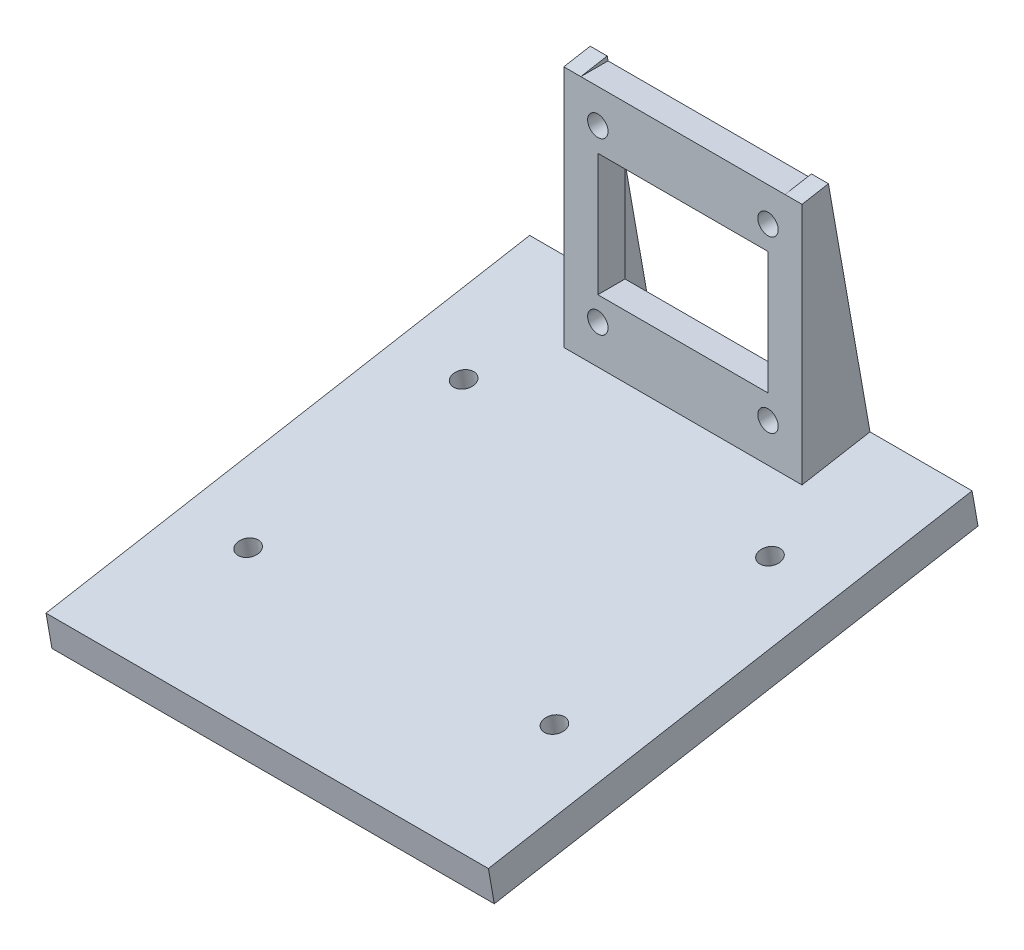
ISO-10303-21;
HEADER;
FILE_DESCRIPTION(('STEP AP214'),'2;1');
FILE_NAME('part.step','',(''),(''),'','','');
FILE_SCHEMA(('AUTOMOTIVE_DESIGN { 1 0 10303 214 1 1 1 1 }'));
ENDSEC;
DATA;
#1=APPLICATION_CONTEXT('core data for automotive mechanical design processes');
#2=APPLICATION_PROTOCOL_DEFINITION('international standard','automotive_design',2000,#1);
#3=PRODUCT_CONTEXT('',#1,'mechanical');
#4=PRODUCT('Part','Part','',(#3));
#5=PRODUCT_RELATED_PRODUCT_CATEGORY('part','',(#4));
#6=PRODUCT_DEFINITION_FORMATION('','',#4);
#7=PRODUCT_DEFINITION_CONTEXT('part definition',#1,'design');
#8=PRODUCT_DEFINITION('design','',#6,#7);
#9=PRODUCT_DEFINITION_SHAPE('','',#8);
#10=(LENGTH_UNIT() NAMED_UNIT(*) SI_UNIT(.MILLI.,.METRE.));
#11=(NAMED_UNIT(*) PLANE_ANGLE_UNIT() SI_UNIT($,.RADIAN.));
#12=(NAMED_UNIT(*) SI_UNIT($,.STERADIAN.) SOLID_ANGLE_UNIT());
#13=UNCERTAINTY_MEASURE_WITH_UNIT(LENGTH_MEASURE(1.E-05),#10,'distance_accuracy_value','');
#14=(GEOMETRIC_REPRESENTATION_CONTEXT(3) GLOBAL_UNCERTAINTY_ASSIGNED_CONTEXT((#13)) GLOBAL_UNIT_ASSIGNED_CONTEXT((#10,
#11,#12)) REPRESENTATION_CONTEXT('',''));
#15=CARTESIAN_POINT('',(0.,0.,0.));
#16=DIRECTION('',(0.,0.,1.));
#17=DIRECTION('',(1.,0.,0.));
#18=AXIS2_PLACEMENT_3D('',#15,#16,#17);
#19=CARTESIAN_POINT('',(0.,0.,4.));
#20=DIRECTION('',(0.,0.,1.));
#21=DIRECTION('',(1.,0.,0.));
#22=AXIS2_PLACEMENT_3D('',#19,#20,#21);
#23=PLANE('',#22);
#24=DIRECTION('',(1.,0.,0.));
#25=VECTOR('',#24,1.);
#26=CARTESIAN_POINT('',(5.,-26.5,4.));
#27=LINE('',#26,#25);
#28=CARTESIAN_POINT('',(5.,-26.5,4.));
#29=VERTEX_POINT('',#28);
#30=CARTESIAN_POINT('',(30.,-26.5,4.));
#31=VERTEX_POINT('',#30);
#32=EDGE_CURVE('E239',#29,#31,#27,.T.);
#33=ORIENTED_EDGE('',*,*,#32,.F.);
#34=DIRECTION('',(0.,-1.,0.));
#35=VECTOR('',#34,1.);
#36=CARTESIAN_POINT('',(5.,-26.5,4.));
#37=LINE('',#36,#35);
#38=CARTESIAN_POINT('',(5.,-8.5,4.));
#39=VERTEX_POINT('',#38);
#40=EDGE_CURVE('E237',#39,#29,#37,.T.);
#41=ORIENTED_EDGE('',*,*,#40,.F.);
#42=DIRECTION('',(-1.,0.,0.));
#43=VECTOR('',#42,1.);
#44=CARTESIAN_POINT('',(5.,-8.5,4.));
#45=LINE('',#44,#43);
#46=CARTESIAN_POINT('',(30.,-8.5,4.));
#47=VERTEX_POINT('',#46);
#48=EDGE_CURVE('E234',#47,#39,#45,.T.);
#49=ORIENTED_EDGE('',*,*,#48,.F.);
#50=DIRECTION('',(0.,1.,0.));
#51=VECTOR('',#50,1.);
#52=CARTESIAN_POINT('',(30.,-26.5,4.));
#53=LINE('',#52,#51);
#54=EDGE_CURVE('E232',#31,#47,#53,.T.);
#55=ORIENTED_EDGE('',*,*,#54,.F.);
#56=EDGE_LOOP('',(#33,#41,#49,#55));
#57=FACE_BOUND('',#56,.T.);
#58=DIRECTION('',(1.,0.,0.));
#59=VECTOR('',#58,1.);
#60=CARTESIAN_POINT('',(-12.493645916048,0.,4.));
#61=LINE('',#60,#59);
#62=CARTESIAN_POINT('',(0.,0.,4.));
#63=VERTEX_POINT('',#62);
#64=CARTESIAN_POINT('',(2.5,0.,4.));
#65=VERTEX_POINT('',#64);
#66=EDGE_CURVE('E192',#63,#65,#61,.T.);
#67=ORIENTED_EDGE('',*,*,#66,.F.);
#68=DIRECTION('',(0.,-1.,0.));
#69=VECTOR('',#68,1.);
#70=CARTESIAN_POINT('',(0.,0.,4.));
#71=LINE('',#70,#69);
#72=CARTESIAN_POINT('',(0.,-35.7053079228339,4.));
#73=VERTEX_POINT('',#72);
#74=EDGE_CURVE('E287',#63,#73,#71,.T.);
#75=ORIENTED_EDGE('',*,*,#74,.T.);
#76=DIRECTION('',(-1.,0.,0.));
#77=VECTOR('',#76,1.);
#78=CARTESIAN_POINT('',(39.061706447543,-35.7053079228339,4.));
#79=LINE('',#78,#77);
#80=CARTESIAN_POINT('',(35.,-35.7053079228339,4.));
#81=VERTEX_POINT('',#80);
#82=EDGE_CURVE('E183',#81,#73,#79,.T.);
#83=ORIENTED_EDGE('',*,*,#82,.F.);
#84=DIRECTION('',(0.,1.,0.));
#85=VECTOR('',#84,1.);
#86=CARTESIAN_POINT('',(35.,0.,4.));
#87=LINE('',#86,#85);
#88=CARTESIAN_POINT('',(35.,0.,4.));
#89=VERTEX_POINT('',#88);
#90=EDGE_CURVE('E289',#81,#89,#87,.T.);
#91=ORIENTED_EDGE('',*,*,#90,.T.);
#92=CARTESIAN_POINT('',(32.5,0.,4.));
#93=VERTEX_POINT('',#92);
#94=EDGE_CURVE('E186',#93,#89,#61,.T.);
#95=ORIENTED_EDGE('',*,*,#94,.F.);
#96=DIRECTION('',(-1.,0.,0.));
#97=VECTOR('',#96,1.);
#98=CARTESIAN_POINT('',(0.,0.,4.));
#99=LINE('',#98,#97);
#100=EDGE_CURVE('E292',#93,#65,#99,.T.);
#101=ORIENTED_EDGE('',*,*,#100,.T.);
#102=EDGE_LOOP('',(#67,#75,#83,#91,#95,#101));
#103=FACE_BOUND('',#102,.T.);
#104=CARTESIAN_POINT('',(30.,-30.,4.));
#105=DIRECTION('',(0.,0.,1.));
#106=DIRECTION('',(-1.,0.,0.));
#107=AXIS2_PLACEMENT_3D('',#104,#105,#106);
#108=CIRCLE('',#107,1.50000000000001);
#109=CARTESIAN_POINT('',(28.5,-30.,4.));
#110=VERTEX_POINT('',#109);
#111=EDGE_CURVE('E275',#110,#110,#108,.T.);
#112=ORIENTED_EDGE('',*,*,#111,.F.);
#113=EDGE_LOOP('',(#112));
#114=FACE_BOUND('',#113,.T.);
#115=CARTESIAN_POINT('',(5.00000000000001,-30.,4.));
#116=DIRECTION('',(0.,0.,1.));
#117=DIRECTION('',(-1.,0.,0.));
#118=AXIS2_PLACEMENT_3D('',#115,#116,#117);
#119=CIRCLE('',#118,1.5);
#120=CARTESIAN_POINT('',(3.50000000000001,-30.,4.));
#121=VERTEX_POINT('',#120);
#122=EDGE_CURVE('E263',#121,#121,#119,.T.);
#123=ORIENTED_EDGE('',*,*,#122,.F.);
#124=EDGE_LOOP('',(#123));
#125=FACE_BOUND('',#124,.T.);
#126=CARTESIAN_POINT('',(5.00000000000001,-5.,4.));
#127=DIRECTION('',(0.,0.,1.));
#128=DIRECTION('',(1.,0.,0.));
#129=AXIS2_PLACEMENT_3D('',#126,#127,#128);
#130=CIRCLE('',#129,1.5);
#131=CARTESIAN_POINT('',(6.50000000000001,-5.,4.));
#132=VERTEX_POINT('',#131);
#133=EDGE_CURVE('E281',#132,#132,#130,.T.);
#134=ORIENTED_EDGE('',*,*,#133,.F.);
#135=EDGE_LOOP('',(#134));
#136=FACE_BOUND('',#135,.T.);
#137=CARTESIAN_POINT('',(30.,-5.,4.));
#138=DIRECTION('',(0.,0.,1.));
#139=DIRECTION('',(1.,0.,0.));
#140=AXIS2_PLACEMENT_3D('',#137,#138,#139);
#141=CIRCLE('',#140,1.50000000000001);
#142=CARTESIAN_POINT('',(31.5,-5.,4.));
#143=VERTEX_POINT('',#142);
#144=EDGE_CURVE('E269',#143,#143,#141,.T.);
#145=ORIENTED_EDGE('',*,*,#144,.F.);
#146=EDGE_LOOP('',(#145));
#147=FACE_BOUND('',#146,.T.);
#148=ADVANCED_FACE('F37',(#57,#103,#114,#125,#136,#147),#23,.T.);
#149=CARTESIAN_POINT('',(0.,0.,0.));
#150=DIRECTION('',(0.,0.,1.));
#151=DIRECTION('',(1.,0.,0.));
#152=AXIS2_PLACEMENT_3D('',#149,#150,#151);
#153=PLANE('',#152);
#154=CARTESIAN_POINT('',(5.00000000000001,-30.,0.));
#155=DIRECTION('',(0.,0.,1.));
#156=DIRECTION('',(-1.,0.,0.));
#157=AXIS2_PLACEMENT_3D('',#154,#155,#156);
#158=CIRCLE('',#157,1.5);
#159=CARTESIAN_POINT('',(3.50000000000001,-30.,0.));
#160=VERTEX_POINT('',#159);
#161=EDGE_CURVE('E262',#160,#160,#158,.T.);
#162=ORIENTED_EDGE('',*,*,#161,.T.);
#163=EDGE_LOOP('',(#162));
#164=FACE_BOUND('',#163,.T.);
#165=CARTESIAN_POINT('',(30.,-5.,0.));
#166=DIRECTION('',(0.,0.,1.));
#167=DIRECTION('',(1.,0.,0.));
#168=AXIS2_PLACEMENT_3D('',#165,#166,#167);
#169=CIRCLE('',#168,1.50000000000001);
#170=CARTESIAN_POINT('',(31.5,-5.,0.));
#171=VERTEX_POINT('',#170);
#172=EDGE_CURVE('E266',#171,#171,#169,.T.);
#173=ORIENTED_EDGE('',*,*,#172,.T.);
#174=EDGE_LOOP('',(#173));
#175=FACE_BOUND('',#174,.T.);
#176=CARTESIAN_POINT('',(30.,-30.,0.));
#177=DIRECTION('',(0.,0.,1.));
#178=DIRECTION('',(-1.,0.,0.));
#179=AXIS2_PLACEMENT_3D('',#176,#177,#178);
#180=CIRCLE('',#179,1.50000000000001);
#181=CARTESIAN_POINT('',(28.5,-30.,0.));
#182=VERTEX_POINT('',#181);
#183=EDGE_CURVE('E272',#182,#182,#180,.T.);
#184=ORIENTED_EDGE('',*,*,#183,.T.);
#185=EDGE_LOOP('',(#184));
#186=FACE_BOUND('',#185,.T.);
#187=CARTESIAN_POINT('',(5.00000000000001,-5.,0.));
#188=DIRECTION('',(0.,0.,1.));
#189=DIRECTION('',(1.,0.,0.));
#190=AXIS2_PLACEMENT_3D('',#187,#188,#189);
#191=CIRCLE('',#190,1.5);
#192=CARTESIAN_POINT('',(6.50000000000001,-5.,0.));
#193=VERTEX_POINT('',#192);
#194=EDGE_CURVE('E278',#193,#193,#191,.T.);
#195=ORIENTED_EDGE('',*,*,#194,.T.);
#196=EDGE_LOOP('',(#195));
#197=FACE_BOUND('',#196,.T.);
#198=DIRECTION('',(-1.,0.,0.));
#199=VECTOR('',#198,1.);
#200=CARTESIAN_POINT('',(0.,0.,0.));
#201=LINE('',#200,#199);
#202=CARTESIAN_POINT('',(32.5,0.,0.));
#203=VERTEX_POINT('',#202);
#204=CARTESIAN_POINT('',(2.5,0.,0.));
#205=VERTEX_POINT('',#204);
#206=EDGE_CURVE('E290',#203,#205,#201,.T.);
#207=ORIENTED_EDGE('',*,*,#206,.F.);
#208=DIRECTION('',(0.,-1.,0.));
#209=VECTOR('',#208,1.);
#210=CARTESIAN_POINT('',(32.5,0.,0.));
#211=LINE('',#210,#209);
#212=CARTESIAN_POINT('',(32.5,-35.,0.));
#213=VERTEX_POINT('',#212);
#214=EDGE_CURVE('E54',#203,#213,#211,.T.);
#215=ORIENTED_EDGE('',*,*,#214,.T.);
#216=DIRECTION('',(1.,0.,0.));
#217=VECTOR('',#216,1.);
#218=CARTESIAN_POINT('',(0.,-35.,0.));
#219=LINE('',#218,#217);
#220=CARTESIAN_POINT('',(2.5,-35.,0.));
#221=VERTEX_POINT('',#220);
#222=EDGE_CURVE('E284',#221,#213,#219,.T.);
#223=ORIENTED_EDGE('',*,*,#222,.F.);
#224=DIRECTION('',(0.,1.,0.));
#225=VECTOR('',#224,1.);
#226=CARTESIAN_POINT('',(2.5,0.,0.));
#227=LINE('',#226,#225);
#228=EDGE_CURVE('E229',#221,#205,#227,.T.);
#229=ORIENTED_EDGE('',*,*,#228,.T.);
#230=EDGE_LOOP('',(#207,#215,#223,#229));
#231=FACE_BOUND('',#230,.T.);
#232=DIRECTION('',(0.,1.,0.));
#233=VECTOR('',#232,1.);
#234=CARTESIAN_POINT('',(30.,-26.5,0.));
#235=LINE('',#234,#233);
#236=CARTESIAN_POINT('',(30.,-26.5,0.));
#237=VERTEX_POINT('',#236);
#238=CARTESIAN_POINT('',(30.,-8.5,0.));
#239=VERTEX_POINT('',#238);
#240=EDGE_CURVE('E242',#237,#239,#235,.T.);
#241=ORIENTED_EDGE('',*,*,#240,.T.);
#242=DIRECTION('',(-1.,0.,0.));
#243=VECTOR('',#242,1.);
#244=CARTESIAN_POINT('',(5.,-8.5,0.));
#245=LINE('',#244,#243);
#246=CARTESIAN_POINT('',(5.,-8.5,0.));
#247=VERTEX_POINT('',#246);
#248=EDGE_CURVE('E245',#239,#247,#245,.T.);
#249=ORIENTED_EDGE('',*,*,#248,.T.);
#250=DIRECTION('',(0.,-1.,0.));
#251=VECTOR('',#250,1.);
#252=CARTESIAN_POINT('',(5.,-26.5,0.));
#253=LINE('',#252,#251);
#254=CARTESIAN_POINT('',(5.,-26.5,0.));
#255=VERTEX_POINT('',#254);
#256=EDGE_CURVE('E248',#247,#255,#253,.T.);
#257=ORIENTED_EDGE('',*,*,#256,.T.);
#258=DIRECTION('',(1.,0.,0.));
#259=VECTOR('',#258,1.);
#260=CARTESIAN_POINT('',(5.,-26.5,0.));
#261=LINE('',#260,#259);
#262=EDGE_CURVE('E235',#255,#237,#261,.T.);
#263=ORIENTED_EDGE('',*,*,#262,.T.);
#264=EDGE_LOOP('',(#241,#249,#257,#263));
#265=FACE_BOUND('',#264,.T.);
#266=ADVANCED_FACE('F321',(#164,#175,#186,#197,#231,#265),#153,.F.);
#267=CARTESIAN_POINT('',(0.,0.,4.));
#268=DIRECTION('',(1.,0.,0.));
#269=DIRECTION('',(0.,0.,-1.));
#270=AXIS2_PLACEMENT_3D('',#267,#268,#269);
#271=PLANE('',#270);
#272=ORIENTED_EDGE('',*,*,#74,.F.);
#273=DIRECTION('',(0.,0.173648177666934,-0.984807753012207));
#274=VECTOR('',#273,1.);
#275=CARTESIAN_POINT('',(0.,0.684040286651359,0.120614758428189));
#276=LINE('',#275,#274);
#277=CARTESIAN_POINT('',(0.,0.684040286651359,0.120614758428189));
#278=VERTEX_POINT('',#277);
#279=EDGE_CURVE('E213',#63,#278,#276,.T.);
#280=ORIENTED_EDGE('',*,*,#279,.T.);
#281=DIRECTION('',(0.,-0.984807753012207,-0.173648177666934));
#282=VECTOR('',#281,1.);
#283=CARTESIAN_POINT('',(0.,0.684040286651359,0.120614758428189));
#284=LINE('',#283,#282);
#285=CARTESIAN_POINT('',(0.,-33.9446208637534,-5.98535250819933));
#286=VERTEX_POINT('',#285);
#287=EDGE_CURVE('E222',#278,#286,#284,.T.);
#288=ORIENTED_EDGE('',*,*,#287,.T.);
#289=DIRECTION('',(0.,0.173648177666934,-0.984807753012207));
#290=VECTOR('',#289,1.);
#291=CARTESIAN_POINT('',(0.,-33.9446208637534,-5.98535250819933));
#292=LINE('',#291,#290);
#293=EDGE_CURVE('E223',#73,#286,#292,.T.);
#294=ORIENTED_EDGE('',*,*,#293,.F.);
#295=EDGE_LOOP('',(#272,#280,#288,#294));
#296=FACE_BOUND('',#295,.T.);
#297=ADVANCED_FACE('F39',(#296),#271,.F.);
#298=CARTESIAN_POINT('',(35.,0.,4.));
#299=DIRECTION('',(-1.,0.,0.));
#300=DIRECTION('',(0.,-1.,0.));
#301=AXIS2_PLACEMENT_3D('',#298,#299,#300);
#302=PLANE('',#301);
#303=DIRECTION('',(0.,-0.173648177666934,0.984807753012207));
#304=VECTOR('',#303,1.);
#305=CARTESIAN_POINT('',(35.,0.684040286651359,0.120614758428189));
#306=LINE('',#305,#304);
#307=CARTESIAN_POINT('',(35.,0.684040286651359,0.120614758428189));
#308=VERTEX_POINT('',#307);
#309=EDGE_CURVE('E198',#308,#89,#306,.T.);
#310=ORIENTED_EDGE('',*,*,#309,.T.);
#311=ORIENTED_EDGE('',*,*,#90,.F.);
#312=DIRECTION('',(0.,-0.173648177666934,0.984807753012207));
#313=VECTOR('',#312,1.);
#314=CARTESIAN_POINT('',(35.,-33.9446208637534,-5.98535250819933));
#315=LINE('',#314,#313);
#316=CARTESIAN_POINT('',(35.,-33.9446208637534,-5.98535250819932));
#317=VERTEX_POINT('',#316);
#318=EDGE_CURVE('E202',#317,#81,#315,.T.);
#319=ORIENTED_EDGE('',*,*,#318,.F.);
#320=DIRECTION('',(0.,-0.984807753012207,-0.173648177666934));
#321=VECTOR('',#320,1.);
#322=CARTESIAN_POINT('',(35.,0.684040286651359,0.120614758428189));
#323=LINE('',#322,#321);
#324=EDGE_CURVE('E194',#308,#317,#323,.T.);
#325=ORIENTED_EDGE('',*,*,#324,.F.);
#326=EDGE_LOOP('',(#310,#311,#319,#325));
#327=FACE_BOUND('',#326,.T.);
#328=ADVANCED_FACE('F364',(#327),#302,.F.);
#329=CARTESIAN_POINT('',(0.,0.,4.));
#330=DIRECTION('',(0.,-1.,0.));
#331=DIRECTION('',(0.,0.,-1.));
#332=AXIS2_PLACEMENT_3D('',#329,#330,#331);
#333=PLANE('',#332);
#334=ORIENTED_EDGE('',*,*,#100,.F.);
#335=DIRECTION('',(0.,0.,-1.));
#336=VECTOR('',#335,1.);
#337=CARTESIAN_POINT('',(32.5,0.,4.));
#338=LINE('',#337,#336);
#339=EDGE_CURVE('E11',#93,#203,#338,.T.);
#340=ORIENTED_EDGE('',*,*,#339,.T.);
#341=ORIENTED_EDGE('',*,*,#206,.T.);
#342=DIRECTION('',(0.,0.,1.));
#343=VECTOR('',#342,1.);
#344=CARTESIAN_POINT('',(2.5,0.,4.));
#345=LINE('',#344,#343);
#346=EDGE_CURVE('E46',#205,#65,#345,.T.);
#347=ORIENTED_EDGE('',*,*,#346,.T.);
#348=EDGE_LOOP('',(#334,#340,#341,#347));
#349=FACE_BOUND('',#348,.T.);
#350=ADVANCED_FACE('F362',(#349),#333,.F.);
#351=CARTESIAN_POINT('',(5.00000000000001,-5.,4.));
#352=DIRECTION('',(0.,0.,-1.));
#353=DIRECTION('',(-1.,0.,0.));
#354=AXIS2_PLACEMENT_3D('',#351,#352,#353);
#355=CYLINDRICAL_SURFACE('',#354,1.5);
#356=ORIENTED_EDGE('',*,*,#133,.T.);
#357=EDGE_LOOP('',(#356));
#358=FACE_BOUND('',#357,.T.);
#359=ORIENTED_EDGE('',*,*,#194,.F.);
#360=EDGE_LOOP('',(#359));
#361=FACE_BOUND('',#360,.T.);
#362=ADVANCED_FACE('F359',(#358,#361),#355,.F.);
#363=CARTESIAN_POINT('',(30.,-30.,4.));
#364=DIRECTION('',(0.,0.,-1.));
#365=DIRECTION('',(-1.,0.,0.));
#366=AXIS2_PLACEMENT_3D('',#363,#364,#365);
#367=CYLINDRICAL_SURFACE('',#366,1.50000000000001);
#368=ORIENTED_EDGE('',*,*,#111,.T.);
#369=EDGE_LOOP('',(#368));
#370=FACE_BOUND('',#369,.T.);
#371=ORIENTED_EDGE('',*,*,#183,.F.);
#372=EDGE_LOOP('',(#371));
#373=FACE_BOUND('',#372,.T.);
#374=ADVANCED_FACE('F692',(#370,#373),#367,.F.);
#375=CARTESIAN_POINT('',(30.,-5.,4.));
#376=DIRECTION('',(0.,0.,-1.));
#377=DIRECTION('',(-1.,0.,0.));
#378=AXIS2_PLACEMENT_3D('',#375,#376,#377);
#379=CYLINDRICAL_SURFACE('',#378,1.50000000000001);
#380=ORIENTED_EDGE('',*,*,#144,.T.);
#381=EDGE_LOOP('',(#380));
#382=FACE_BOUND('',#381,.T.);
#383=ORIENTED_EDGE('',*,*,#172,.F.);
#384=EDGE_LOOP('',(#383));
#385=FACE_BOUND('',#384,.T.);
#386=ADVANCED_FACE('F681',(#382,#385),#379,.F.);
#387=CARTESIAN_POINT('',(5.00000000000001,-30.,4.));
#388=DIRECTION('',(0.,0.,-1.));
#389=DIRECTION('',(-1.,0.,0.));
#390=AXIS2_PLACEMENT_3D('',#387,#388,#389);
#391=CYLINDRICAL_SURFACE('',#390,1.5);
#392=ORIENTED_EDGE('',*,*,#122,.T.);
#393=EDGE_LOOP('',(#392));
#394=FACE_BOUND('',#393,.T.);
#395=ORIENTED_EDGE('',*,*,#161,.F.);
#396=EDGE_LOOP('',(#395));
#397=FACE_BOUND('',#396,.T.);
#398=ADVANCED_FACE('F649',(#394,#397),#391,.F.);
#399=CARTESIAN_POINT('',(30.,-26.5,4.));
#400=DIRECTION('',(-1.,0.,0.));
#401=DIRECTION('',(0.,0.,1.));
#402=AXIS2_PLACEMENT_3D('',#399,#400,#401);
#403=PLANE('',#402);
#404=ORIENTED_EDGE('',*,*,#240,.F.);
#405=DIRECTION('',(0.,0.,-1.));
#406=VECTOR('',#405,1.);
#407=CARTESIAN_POINT('',(30.,-26.5,4.));
#408=LINE('',#407,#406);
#409=EDGE_CURVE('E241',#31,#237,#408,.T.);
#410=ORIENTED_EDGE('',*,*,#409,.F.);
#411=ORIENTED_EDGE('',*,*,#54,.T.);
#412=DIRECTION('',(0.,0.,-1.));
#413=VECTOR('',#412,1.);
#414=CARTESIAN_POINT('',(30.,-8.5,4.));
#415=LINE('',#414,#413);
#416=EDGE_CURVE('E259',#47,#239,#415,.T.);
#417=ORIENTED_EDGE('',*,*,#416,.T.);
#418=EDGE_LOOP('',(#404,#410,#411,#417));
#419=FACE_BOUND('',#418,.T.);
#420=ADVANCED_FACE('F329',(#419),#403,.T.);
#421=CARTESIAN_POINT('',(5.,-8.5,4.));
#422=DIRECTION('',(0.,-1.,0.));
#423=DIRECTION('',(0.,0.,-1.));
#424=AXIS2_PLACEMENT_3D('',#421,#422,#423);
#425=PLANE('',#424);
#426=ORIENTED_EDGE('',*,*,#248,.F.);
#427=ORIENTED_EDGE('',*,*,#416,.F.);
#428=ORIENTED_EDGE('',*,*,#48,.T.);
#429=DIRECTION('',(0.,0.,-1.));
#430=VECTOR('',#429,1.);
#431=CARTESIAN_POINT('',(5.,-8.5,4.));
#432=LINE('',#431,#430);
#433=EDGE_CURVE('E257',#39,#247,#432,.T.);
#434=ORIENTED_EDGE('',*,*,#433,.T.);
#435=EDGE_LOOP('',(#426,#427,#428,#434));
#436=FACE_BOUND('',#435,.T.);
#437=ADVANCED_FACE('F341',(#436),#425,.T.);
#438=CARTESIAN_POINT('',(5.,-26.5,4.));
#439=DIRECTION('',(1.,0.,0.));
#440=DIRECTION('',(0.,0.,-1.));
#441=AXIS2_PLACEMENT_3D('',#438,#439,#440);
#442=PLANE('',#441);
#443=ORIENTED_EDGE('',*,*,#256,.F.);
#444=ORIENTED_EDGE('',*,*,#433,.F.);
#445=ORIENTED_EDGE('',*,*,#40,.T.);
#446=DIRECTION('',(0.,0.,-1.));
#447=VECTOR('',#446,1.);
#448=CARTESIAN_POINT('',(5.,-26.5,4.));
#449=LINE('',#448,#447);
#450=EDGE_CURVE('E255',#29,#255,#449,.T.);
#451=ORIENTED_EDGE('',*,*,#450,.T.);
#452=EDGE_LOOP('',(#443,#444,#445,#451));
#453=FACE_BOUND('',#452,.T.);
#454=ADVANCED_FACE('F345',(#453),#442,.T.);
#455=CARTESIAN_POINT('',(5.,-26.5,4.));
#456=DIRECTION('',(0.,1.,0.));
#457=DIRECTION('',(0.,0.,1.));
#458=AXIS2_PLACEMENT_3D('',#455,#456,#457);
#459=PLANE('',#458);
#460=ORIENTED_EDGE('',*,*,#262,.F.);
#461=ORIENTED_EDGE('',*,*,#450,.F.);
#462=ORIENTED_EDGE('',*,*,#32,.T.);
#463=ORIENTED_EDGE('',*,*,#409,.T.);
#464=EDGE_LOOP('',(#460,#461,#462,#463));
#465=FACE_BOUND('',#464,.T.);
#466=ADVANCED_FACE('F333',(#465),#459,.T.);
#467=CARTESIAN_POINT('',(2.5,0.684040286651359,0.12061475842819));
#468=DIRECTION('',(1.,0.,0.));
#469=DIRECTION('',(0.,0.,-1.));
#470=AXIS2_PLACEMENT_3D('',#467,#468,#469);
#471=PLANE('',#470);
#472=ORIENTED_EDGE('',*,*,#228,.F.);
#473=DIRECTION('',(0.,-0.173648177666934,0.984807753012207));
#474=VECTOR('',#473,1.);
#475=CARTESIAN_POINT('',(2.5,-33.9446208637534,-5.98535250819932));
#476=LINE('',#475,#474);
#477=CARTESIAN_POINT('',(2.5,-33.9446208637534,-5.98535250819932));
#478=VERTEX_POINT('',#477);
#479=EDGE_CURVE('E216',#478,#221,#476,.T.);
#480=ORIENTED_EDGE('',*,*,#479,.F.);
#481=DIRECTION('',(0.,-0.984807753012207,-0.173648177666934));
#482=VECTOR('',#481,1.);
#483=CARTESIAN_POINT('',(2.5,0.684040286651359,0.12061475842819));
#484=LINE('',#483,#482);
#485=EDGE_CURVE('E230',#205,#478,#484,.T.);
#486=ORIENTED_EDGE('',*,*,#485,.F.);
#487=EDGE_LOOP('',(#472,#480,#486));
#488=FACE_BOUND('',#487,.T.);
#489=ADVANCED_FACE('F320',(#488),#471,.T.);
#490=ORIENTED_EDGE('',*,*,#346,.F.);
#491=CARTESIAN_POINT('',(2.5,0.684040286651359,0.12061475842819));
#492=VERTEX_POINT('',#491);
#493=EDGE_CURVE('E226',#492,#205,#484,.T.);
#494=ORIENTED_EDGE('',*,*,#493,.F.);
#495=DIRECTION('',(0.,-0.173648177666934,0.984807753012207));
#496=VECTOR('',#495,1.);
#497=CARTESIAN_POINT('',(2.5,0.684040286651359,0.12061475842819));
#498=LINE('',#497,#496);
#499=EDGE_CURVE('E219',#492,#65,#498,.T.);
#500=ORIENTED_EDGE('',*,*,#499,.T.);
#501=EDGE_LOOP('',(#490,#494,#500));
#502=FACE_BOUND('',#501,.T.);
#503=ADVANCED_FACE('F404',(#502),#471,.T.);
#504=CARTESIAN_POINT('',(0.,0.684040286651359,0.120614758428189));
#505=DIRECTION('',(0.,0.173648177666934,-0.984807753012207));
#506=DIRECTION('',(0.,0.984807753012207,0.173648177666934));
#507=AXIS2_PLACEMENT_3D('',#504,#505,#506);
#508=PLANE('',#507);
#509=ORIENTED_EDGE('',*,*,#493,.T.);
#510=ORIENTED_EDGE('',*,*,#485,.T.);
#511=DIRECTION('',(1.,0.,0.));
#512=VECTOR('',#511,1.);
#513=CARTESIAN_POINT('',(-15.,-33.9446208637534,-5.98535250819932));
#514=LINE('',#513,#512);
#515=CARTESIAN_POINT('',(32.5,-33.9446208637534,-5.98535250819932));
#516=VERTEX_POINT('',#515);
#517=EDGE_CURVE('E317',#478,#516,#514,.T.);
#518=ORIENTED_EDGE('',*,*,#517,.T.);
#519=DIRECTION('',(0.,-0.984807753012207,-0.173648177666934));
#520=VECTOR('',#519,1.);
#521=CARTESIAN_POINT('',(32.5,0.684040286651359,0.12061475842819));
#522=LINE('',#521,#520);
#523=EDGE_CURVE('E199',#203,#516,#522,.T.);
#524=ORIENTED_EDGE('',*,*,#523,.F.);
#525=CARTESIAN_POINT('',(32.5,0.684040286651359,0.12061475842819));
#526=VERTEX_POINT('',#525);
#527=EDGE_CURVE('E195',#526,#203,#522,.T.);
#528=ORIENTED_EDGE('',*,*,#527,.F.);
#529=DIRECTION('',(1.,0.,0.));
#530=VECTOR('',#529,1.);
#531=CARTESIAN_POINT('',(35.,0.684040286651359,0.120614758428189));
#532=LINE('',#531,#530);
#533=EDGE_CURVE('E209',#526,#308,#532,.T.);
#534=ORIENTED_EDGE('',*,*,#533,.T.);
#535=ORIENTED_EDGE('',*,*,#324,.T.);
#536=CARTESIAN_POINT('',(50.,-33.9446208637534,-5.98535250819932));
#537=VERTEX_POINT('',#536);
#538=EDGE_CURVE('E421',#317,#537,#514,.T.);
#539=ORIENTED_EDGE('',*,*,#538,.T.);
#540=DIRECTION('',(0.,0.984807753012208,0.173648177666934));
#541=VECTOR('',#540,1.);
#542=CARTESIAN_POINT('',(50.,-38.8686596288144,-6.85359339653399));
#543=LINE('',#542,#541);
#544=CARTESIAN_POINT('',(50.,-38.8686596288144,-6.85359339653399));
#545=VERTEX_POINT('',#544);
#546=EDGE_CURVE('E188',#545,#537,#543,.T.);
#547=ORIENTED_EDGE('',*,*,#546,.F.);
#548=DIRECTION('',(1.,0.,0.));
#549=VECTOR('',#548,1.);
#550=CARTESIAN_POINT('',(-15.,-38.8686596288144,-6.85359339653399));
#551=LINE('',#550,#549);
#552=CARTESIAN_POINT('',(-15.,-38.8686596288144,-6.85359339653399));
#553=VERTEX_POINT('',#552);
#554=EDGE_CURVE('E168',#553,#545,#551,.T.);
#555=ORIENTED_EDGE('',*,*,#554,.F.);
#556=DIRECTION('',(0.,0.984807753012208,0.173648177666934));
#557=VECTOR('',#556,1.);
#558=CARTESIAN_POINT('',(-15.,-38.8686596288144,-6.85359339653399));
#559=LINE('',#558,#557);
#560=CARTESIAN_POINT('',(-15.,-33.9446208637534,-5.98535250819932));
#561=VERTEX_POINT('',#560);
#562=EDGE_CURVE('E165',#553,#561,#559,.T.);
#563=ORIENTED_EDGE('',*,*,#562,.T.);
#564=EDGE_CURVE('E426',#561,#286,#514,.T.);
#565=ORIENTED_EDGE('',*,*,#564,.T.);
#566=ORIENTED_EDGE('',*,*,#287,.F.);
#567=DIRECTION('',(1.,0.,0.));
#568=VECTOR('',#567,1.);
#569=CARTESIAN_POINT('',(0.,0.684040286651359,0.120614758428189));
#570=LINE('',#569,#568);
#571=EDGE_CURVE('E215',#278,#492,#570,.T.);
#572=ORIENTED_EDGE('',*,*,#571,.T.);
#573=EDGE_LOOP('',(#509,#510,#518,#524,#528,#534,#535,#539,#547,#555,#563,#565,#566,#572));
#574=FACE_BOUND('',#573,.T.);
#575=ADVANCED_FACE('F380',(#574),#508,.T.);
#576=CARTESIAN_POINT('',(0.,0.684040286651352,0.120614758428181));
#577=DIRECTION('',(0.,-0.984807753012208,-0.173648177666934));
#578=DIRECTION('',(0.,0.173648177666934,-0.984807753012207));
#579=AXIS2_PLACEMENT_3D('',#576,#577,#578);
#580=PLANE('',#579);
#581=ORIENTED_EDGE('',*,*,#279,.F.);
#582=ORIENTED_EDGE('',*,*,#66,.T.);
#583=ORIENTED_EDGE('',*,*,#499,.F.);
#584=ORIENTED_EDGE('',*,*,#571,.F.);
#585=EDGE_LOOP('',(#581,#582,#583,#584));
#586=FACE_BOUND('',#585,.T.);
#587=ADVANCED_FACE('F394',(#586),#580,.F.);
#588=CARTESIAN_POINT('',(32.5,0.684040286651359,0.12061475842819));
#589=DIRECTION('',(-1.,0.,0.));
#590=DIRECTION('',(0.,0.,1.));
#591=AXIS2_PLACEMENT_3D('',#588,#589,#590);
#592=PLANE('',#591);
#593=ORIENTED_EDGE('',*,*,#214,.F.);
#594=ORIENTED_EDGE('',*,*,#523,.T.);
#595=DIRECTION('',(0.,0.173648177666934,-0.984807753012207));
#596=VECTOR('',#595,1.);
#597=CARTESIAN_POINT('',(32.5,-33.9446208637534,-5.98535250819932));
#598=LINE('',#597,#596);
#599=EDGE_CURVE('E205',#213,#516,#598,.T.);
#600=ORIENTED_EDGE('',*,*,#599,.F.);
#601=EDGE_LOOP('',(#593,#594,#600));
#602=FACE_BOUND('',#601,.T.);
#603=ADVANCED_FACE('F386',(#602),#592,.T.);
#604=ORIENTED_EDGE('',*,*,#339,.F.);
#605=DIRECTION('',(0.,0.173648177666934,-0.984807753012207));
#606=VECTOR('',#605,1.);
#607=CARTESIAN_POINT('',(32.5,0.684040286651359,0.12061475842819));
#608=LINE('',#607,#606);
#609=EDGE_CURVE('E206',#93,#526,#608,.T.);
#610=ORIENTED_EDGE('',*,*,#609,.T.);
#611=ORIENTED_EDGE('',*,*,#527,.T.);
#612=EDGE_LOOP('',(#604,#610,#611));
#613=FACE_BOUND('',#612,.T.);
#614=ADVANCED_FACE('F384',(#613),#592,.T.);
#615=CARTESIAN_POINT('',(0.,0.684040286651352,0.120614758428181));
#616=DIRECTION('',(0.,-0.984807753012208,-0.173648177666934));
#617=DIRECTION('',(0.,0.173648177666934,-0.984807753012207));
#618=AXIS2_PLACEMENT_3D('',#615,#616,#617);
#619=PLANE('',#618);
#620=ORIENTED_EDGE('',*,*,#609,.F.);
#621=ORIENTED_EDGE('',*,*,#94,.T.);
#622=ORIENTED_EDGE('',*,*,#309,.F.);
#623=ORIENTED_EDGE('',*,*,#533,.F.);
#624=EDGE_LOOP('',(#620,#621,#622,#623));
#625=FACE_BOUND('',#624,.T.);
#626=ADVANCED_FACE('F377',(#625),#619,.F.);
#627=CARTESIAN_POINT('',(0.,-33.9446208637534,-5.98535250819932));
#628=DIRECTION('',(0.,0.984807753012207,0.173648177666934));
#629=DIRECTION('',(0.,-0.173648177666934,0.984807753012207));
#630=AXIS2_PLACEMENT_3D('',#627,#628,#629);
#631=PLANE('',#630);
#632=CARTESIAN_POINT('',(40.,-37.4175844170921,13.7108025520448));
#633=DIRECTION('',(0.,0.984807753012208,0.173648177666934));
#634=DIRECTION('',(0.,0.173648177666934,-0.984807753012208));
#635=AXIS2_PLACEMENT_3D('',#632,#633,#634);
#636=CIRCLE('',#635,1.5);
#637=CARTESIAN_POINT('',(40.,-37.1571121505917,12.2335909225265));
#638=VERTEX_POINT('',#637);
#639=EDGE_CURVE('E449',#638,#638,#636,.T.);
#640=ORIENTED_EDGE('',*,*,#639,.F.);
#641=EDGE_LOOP('',(#640));
#642=FACE_BOUND('',#641,.T.);
#643=CARTESIAN_POINT('',(40.,-43.001306242924,45.3776626286876));
#644=DIRECTION('',(0.,0.984807753012208,0.173648177666934));
#645=DIRECTION('',(0.,0.173648177666934,-0.984807753012208));
#646=AXIS2_PLACEMENT_3D('',#643,#644,#645);
#647=CIRCLE('',#646,1.5);
#648=CARTESIAN_POINT('',(40.,-42.7408339764236,43.9004509991693));
#649=VERTEX_POINT('',#648);
#650=EDGE_CURVE('E456',#649,#649,#647,.T.);
#651=ORIENTED_EDGE('',*,*,#650,.F.);
#652=EDGE_LOOP('',(#651));
#653=FACE_BOUND('',#652,.T.);
#654=CARTESIAN_POINT('',(-4.99999999999999,-43.001306242924,45.3776626286876));
#655=DIRECTION('',(0.,0.984807753012208,0.173648177666934));
#656=DIRECTION('',(0.,-0.173648177666934,0.984807753012208));
#657=AXIS2_PLACEMENT_3D('',#654,#655,#656);
#658=CIRCLE('',#657,1.5);
#659=CARTESIAN_POINT('',(-4.99999999999999,-43.2617785094244,46.8548742582059));
#660=VERTEX_POINT('',#659);
#661=EDGE_CURVE('E446',#660,#660,#658,.T.);
#662=ORIENTED_EDGE('',*,*,#661,.F.);
#663=EDGE_LOOP('',(#662));
#664=FACE_BOUND('',#663,.T.);
#665=CARTESIAN_POINT('',(-4.99999999999999,-37.4175844170921,13.7108025520448));
#666=DIRECTION('',(0.,0.984807753012208,0.173648177666934));
#667=DIRECTION('',(0.,-0.173648177666934,0.984807753012208));
#668=AXIS2_PLACEMENT_3D('',#665,#666,#667);
#669=CIRCLE('',#668,1.5);
#670=CARTESIAN_POINT('',(-4.99999999999999,-37.6780566835925,15.1880141815631));
#671=VERTEX_POINT('',#670);
#672=EDGE_CURVE('E441',#671,#671,#669,.T.);
#673=ORIENTED_EDGE('',*,*,#672,.F.);
#674=EDGE_LOOP('',(#673));
#675=FACE_BOUND('',#674,.T.);
#676=ORIENTED_EDGE('',*,*,#293,.T.);
#677=ORIENTED_EDGE('',*,*,#564,.F.);
#678=DIRECTION('',(0.,0.173648177666934,-0.984807753012207));
#679=VECTOR('',#678,1.);
#680=CARTESIAN_POINT('',(-15.,-46.4742697962627,65.0738176889318));
#681=LINE('',#680,#679);
#682=CARTESIAN_POINT('',(-15.,-46.4742697962627,65.0738176889318));
#683=VERTEX_POINT('',#682);
#684=EDGE_CURVE('E424',#683,#561,#681,.T.);
#685=ORIENTED_EDGE('',*,*,#684,.F.);
#686=DIRECTION('',(-1.,0.,0.));
#687=VECTOR('',#686,1.);
#688=CARTESIAN_POINT('',(-15.,-46.4742697962627,65.0738176889318));
#689=LINE('',#688,#687);
#690=CARTESIAN_POINT('',(50.,-46.4742697962627,65.0738176889318));
#691=VERTEX_POINT('',#690);
#692=EDGE_CURVE('E182',#691,#683,#689,.T.);
#693=ORIENTED_EDGE('',*,*,#692,.F.);
#694=DIRECTION('',(0.,-0.173648177666934,0.984807753012207));
#695=VECTOR('',#694,1.);
#696=CARTESIAN_POINT('',(50.,-46.4742697962627,65.0738176889318));
#697=LINE('',#696,#695);
#698=EDGE_CURVE('E178',#537,#691,#697,.T.);
#699=ORIENTED_EDGE('',*,*,#698,.F.);
#700=ORIENTED_EDGE('',*,*,#538,.F.);
#701=ORIENTED_EDGE('',*,*,#318,.T.);
#702=ORIENTED_EDGE('',*,*,#82,.T.);
#703=EDGE_LOOP('',(#676,#677,#685,#693,#699,#700,#701,#702));
#704=FACE_BOUND('',#703,.T.);
#705=ADVANCED_FACE('F392',(#642,#653,#664,#675,#704),#631,.T.);
#706=CARTESIAN_POINT('',(-15.,-51.3983085613237,64.2055768005971));
#707=DIRECTION('',(0.,0.173648177666934,-0.984807753012208));
#708=DIRECTION('',(0.,0.984807753012208,0.173648177666934));
#709=AXIS2_PLACEMENT_3D('',#706,#707,#708);
#710=PLANE('',#709);
#711=ORIENTED_EDGE('',*,*,#692,.T.);
#712=DIRECTION('',(0.,0.984807753012208,0.173648177666934));
#713=VECTOR('',#712,1.);
#714=CARTESIAN_POINT('',(-15.,-51.3983085613237,64.2055768005971));
#715=LINE('',#714,#713);
#716=CARTESIAN_POINT('',(-15.,-51.3983085613237,64.2055768005971));
#717=VERTEX_POINT('',#716);
#718=EDGE_CURVE('E162',#717,#683,#715,.T.);
#719=ORIENTED_EDGE('',*,*,#718,.F.);
#720=DIRECTION('',(-1.,0.,0.));
#721=VECTOR('',#720,1.);
#722=CARTESIAN_POINT('',(-15.,-51.3983085613237,64.2055768005971));
#723=LINE('',#722,#721);
#724=CARTESIAN_POINT('',(50.,-51.3983085613237,64.2055768005971));
#725=VERTEX_POINT('',#724);
#726=EDGE_CURVE('E169',#725,#717,#723,.T.);
#727=ORIENTED_EDGE('',*,*,#726,.F.);
#728=DIRECTION('',(0.,0.984807753012208,0.173648177666934));
#729=VECTOR('',#728,1.);
#730=CARTESIAN_POINT('',(50.,-51.3983085613237,64.2055768005971));
#731=LINE('',#730,#729);
#732=EDGE_CURVE('E434',#725,#691,#731,.T.);
#733=ORIENTED_EDGE('',*,*,#732,.T.);
#734=EDGE_LOOP('',(#711,#719,#727,#733));
#735=FACE_BOUND('',#734,.T.);
#736=ADVANCED_FACE('F180',(#735),#710,.F.);
#737=CARTESIAN_POINT('',(-15.,-51.3983085613237,64.2055768005971));
#738=DIRECTION('',(1.,0.,0.));
#739=DIRECTION('',(0.,0.,-1.));
#740=AXIS2_PLACEMENT_3D('',#737,#738,#739);
#741=PLANE('',#740);
#742=ORIENTED_EDGE('',*,*,#684,.T.);
#743=ORIENTED_EDGE('',*,*,#562,.F.);
#744=DIRECTION('',(0.,0.173648177666934,-0.984807753012207));
#745=VECTOR('',#744,1.);
#746=CARTESIAN_POINT('',(-15.,-51.3983085613237,64.2055768005971));
#747=LINE('',#746,#745);
#748=EDGE_CURVE('E158',#717,#553,#747,.T.);
#749=ORIENTED_EDGE('',*,*,#748,.F.);
#750=ORIENTED_EDGE('',*,*,#718,.T.);
#751=EDGE_LOOP('',(#742,#743,#749,#750));
#752=FACE_BOUND('',#751,.T.);
#753=ADVANCED_FACE('F160',(#752),#741,.F.);
#754=CARTESIAN_POINT('',(50.,-51.3983085613237,64.2055768005971));
#755=DIRECTION('',(-1.,0.,0.));
#756=DIRECTION('',(0.,0.,1.));
#757=AXIS2_PLACEMENT_3D('',#754,#755,#756);
#758=PLANE('',#757);
#759=ORIENTED_EDGE('',*,*,#698,.T.);
#760=ORIENTED_EDGE('',*,*,#732,.F.);
#761=DIRECTION('',(0.,-0.173648177666934,0.984807753012207));
#762=VECTOR('',#761,1.);
#763=CARTESIAN_POINT('',(50.,-51.3983085613237,64.2055768005971));
#764=LINE('',#763,#762);
#765=EDGE_CURVE('E174',#545,#725,#764,.T.);
#766=ORIENTED_EDGE('',*,*,#765,.F.);
#767=ORIENTED_EDGE('',*,*,#546,.T.);
#768=EDGE_LOOP('',(#759,#760,#766,#767));
#769=FACE_BOUND('',#768,.T.);
#770=ADVANCED_FACE('F435',(#769),#758,.F.);
#771=CARTESIAN_POINT('',(0.,-38.8686596288144,-6.85359339653399));
#772=DIRECTION('',(0.,0.984807753012207,0.173648177666934));
#773=DIRECTION('',(0.,-0.173648177666934,0.984807753012207));
#774=AXIS2_PLACEMENT_3D('',#771,#772,#773);
#775=PLANE('',#774);
#776=CARTESIAN_POINT('',(40.,-42.3416231821531,12.8425616637102));
#777=DIRECTION('',(0.,0.984807753012207,0.173648177666934));
#778=DIRECTION('',(0.,-0.173648177666934,0.984807753012207));
#779=AXIS2_PLACEMENT_3D('',#776,#777,#778);
#780=CIRCLE('',#779,1.5);
#781=CARTESIAN_POINT('',(40.,-42.6020954486535,14.3197732932285));
#782=VERTEX_POINT('',#781);
#783=EDGE_CURVE('E453',#782,#782,#780,.F.);
#784=ORIENTED_EDGE('',*,*,#783,.F.);
#785=EDGE_LOOP('',(#784));
#786=FACE_BOUND('',#785,.T.);
#787=CARTESIAN_POINT('',(40.,-47.9253450079851,44.509421740353));
#788=DIRECTION('',(0.,0.984807753012207,0.173648177666934));
#789=DIRECTION('',(0.,-0.173648177666934,0.984807753012207));
#790=AXIS2_PLACEMENT_3D('',#787,#788,#789);
#791=CIRCLE('',#790,1.5);
#792=CARTESIAN_POINT('',(40.,-48.1858172744855,45.9866333698713));
#793=VERTEX_POINT('',#792);
#794=EDGE_CURVE('E452',#793,#793,#791,.F.);
#795=ORIENTED_EDGE('',*,*,#794,.F.);
#796=EDGE_LOOP('',(#795));
#797=FACE_BOUND('',#796,.T.);
#798=CARTESIAN_POINT('',(-4.99999999999999,-47.9253450079851,44.509421740353));
#799=DIRECTION('',(0.,0.984807753012207,0.173648177666934));
#800=DIRECTION('',(0.,-0.173648177666934,0.984807753012207));
#801=AXIS2_PLACEMENT_3D('',#798,#799,#800);
#802=CIRCLE('',#801,1.5);
#803=CARTESIAN_POINT('',(-4.99999999999999,-48.1858172744855,45.9866333698713));
#804=VERTEX_POINT('',#803);
#805=EDGE_CURVE('E459',#804,#804,#802,.F.);
#806=ORIENTED_EDGE('',*,*,#805,.F.);
#807=EDGE_LOOP('',(#806));
#808=FACE_BOUND('',#807,.T.);
#809=CARTESIAN_POINT('',(-4.99999999999999,-42.3416231821531,12.8425616637102));
#810=DIRECTION('',(0.,0.984807753012207,0.173648177666934));
#811=DIRECTION('',(0.,-0.173648177666934,0.984807753012207));
#812=AXIS2_PLACEMENT_3D('',#809,#810,#811);
#813=CIRCLE('',#812,1.5);
#814=CARTESIAN_POINT('',(-4.99999999999999,-42.6020954486535,14.3197732932285));
#815=VERTEX_POINT('',#814);
#816=EDGE_CURVE('E439',#815,#815,#813,.F.);
#817=ORIENTED_EDGE('',*,*,#816,.F.);
#818=EDGE_LOOP('',(#817));
#819=FACE_BOUND('',#818,.T.);
#820=ORIENTED_EDGE('',*,*,#726,.T.);
#821=ORIENTED_EDGE('',*,*,#748,.T.);
#822=ORIENTED_EDGE('',*,*,#554,.T.);
#823=ORIENTED_EDGE('',*,*,#765,.T.);
#824=EDGE_LOOP('',(#820,#821,#822,#823));
#825=FACE_BOUND('',#824,.T.);
#826=ADVANCED_FACE('F172',(#786,#797,#808,#819,#825),#775,.F.);
#827=ORIENTED_EDGE('',*,*,#517,.F.);
#828=ORIENTED_EDGE('',*,*,#479,.T.);
#829=ORIENTED_EDGE('',*,*,#222,.T.);
#830=ORIENTED_EDGE('',*,*,#599,.T.);
#831=EDGE_LOOP('',(#827,#828,#829,#830));
#832=FACE_BOUND('',#831,.T.);
#833=ADVANCED_FACE('F315',(#832),#631,.T.);
#834=CARTESIAN_POINT('',(-4.99999999999999,-46.5198086240732,12.1058348398963));
#835=DIRECTION('',(0.,0.984807753012207,0.173648177666934));
#836=DIRECTION('',(0.,-0.173648177666934,0.984807753012207));
#837=AXIS2_PLACEMENT_3D('',#834,#835,#836);
#838=CYLINDRICAL_SURFACE('',#837,1.5);
#839=ORIENTED_EDGE('',*,*,#816,.T.);
#840=EDGE_LOOP('',(#839));
#841=FACE_BOUND('',#840,.T.);
#842=ORIENTED_EDGE('',*,*,#672,.T.);
#843=EDGE_LOOP('',(#842));
#844=FACE_BOUND('',#843,.T.);
#845=ADVANCED_FACE('F478',(#841,#844),#838,.F.);
#846=CARTESIAN_POINT('',(-4.99999999999999,-52.1035304499052,43.7726949165391));
#847=DIRECTION('',(0.,0.984807753012207,0.173648177666934));
#848=DIRECTION('',(0.,-0.173648177666934,0.984807753012207));
#849=AXIS2_PLACEMENT_3D('',#846,#847,#848);
#850=CYLINDRICAL_SURFACE('',#849,1.5);
#851=ORIENTED_EDGE('',*,*,#805,.T.);
#852=EDGE_LOOP('',(#851));
#853=FACE_BOUND('',#852,.T.);
#854=ORIENTED_EDGE('',*,*,#661,.T.);
#855=EDGE_LOOP('',(#854));
#856=FACE_BOUND('',#855,.T.);
#857=ADVANCED_FACE('F467',(#853,#856),#850,.F.);
#858=CARTESIAN_POINT('',(40.,-52.1035304499052,43.7726949165391));
#859=DIRECTION('',(0.,0.984807753012207,0.173648177666934));
#860=DIRECTION('',(0.,-0.173648177666934,0.984807753012207));
#861=AXIS2_PLACEMENT_3D('',#858,#859,#860);
#862=CYLINDRICAL_SURFACE('',#861,1.5);
#863=ORIENTED_EDGE('',*,*,#794,.T.);
#864=EDGE_LOOP('',(#863));
#865=FACE_BOUND('',#864,.T.);
#866=ORIENTED_EDGE('',*,*,#650,.T.);
#867=EDGE_LOOP('',(#866));
#868=FACE_BOUND('',#867,.T.);
#869=ADVANCED_FACE('F507',(#865,#868),#862,.F.);
#870=CARTESIAN_POINT('',(40.,-46.5198086240732,12.1058348398963));
#871=DIRECTION('',(0.,0.984807753012207,0.173648177666934));
#872=DIRECTION('',(0.,-0.173648177666934,0.984807753012207));
#873=AXIS2_PLACEMENT_3D('',#870,#871,#872);
#874=CYLINDRICAL_SURFACE('',#873,1.5);
#875=ORIENTED_EDGE('',*,*,#783,.T.);
#876=EDGE_LOOP('',(#875));
#877=FACE_BOUND('',#876,.T.);
#878=ORIENTED_EDGE('',*,*,#639,.T.);
#879=EDGE_LOOP('',(#878));
#880=FACE_BOUND('',#879,.T.);
#881=ADVANCED_FACE('F512',(#877,#880),#874,.F.);
#882=CLOSED_SHELL('',(#148,#266,#297,#328,#350,#362,#374,#386,#398,#420,#437,#454,#466,#489,
#503,#575,#587,#603,#614,#626,#705,#736,#753,#770,#826,#833,#845,#857,#869,#881));
#883=MANIFOLD_SOLID_BREP('B2',#882);
#884=ADVANCED_BREP_SHAPE_REPRESENTATION('',(#18,#883),#14);
#885=SHAPE_DEFINITION_REPRESENTATION(#9,#884);
ENDSEC;
END-ISO-10303-21;
